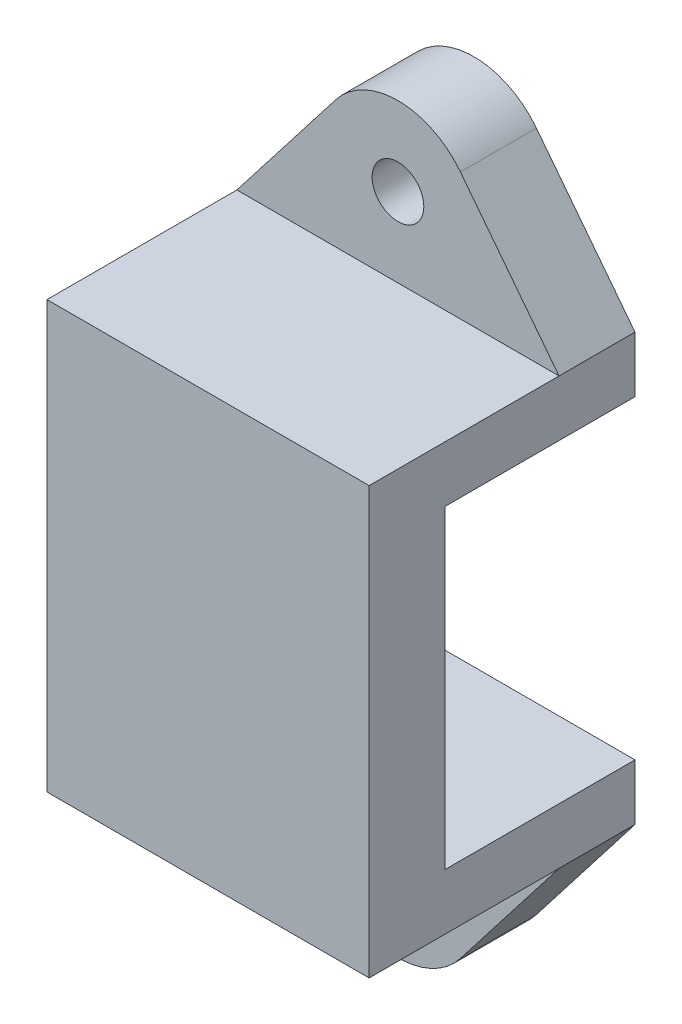
ISO-10303-21;
HEADER;
FILE_DESCRIPTION(('STEP AP214'),'2;1');
FILE_NAME('part.step','',(''),(''),'','','');
FILE_SCHEMA(('AUTOMOTIVE_DESIGN { 1 0 10303 214 1 1 1 1 }'));
ENDSEC;
DATA;
#1=APPLICATION_CONTEXT('core data for automotive mechanical design processes');
#2=APPLICATION_PROTOCOL_DEFINITION('international standard','automotive_design',2000,#1);
#3=PRODUCT_CONTEXT('',#1,'mechanical');
#4=PRODUCT('Part','Part','',(#3));
#5=PRODUCT_RELATED_PRODUCT_CATEGORY('part','',(#4));
#6=PRODUCT_DEFINITION_FORMATION('','',#4);
#7=PRODUCT_DEFINITION_CONTEXT('part definition',#1,'design');
#8=PRODUCT_DEFINITION('design','',#6,#7);
#9=PRODUCT_DEFINITION_SHAPE('','',#8);
#10=(LENGTH_UNIT() NAMED_UNIT(*) SI_UNIT(.MILLI.,.METRE.));
#11=(NAMED_UNIT(*) PLANE_ANGLE_UNIT() SI_UNIT($,.RADIAN.));
#12=(NAMED_UNIT(*) SI_UNIT($,.STERADIAN.) SOLID_ANGLE_UNIT());
#13=UNCERTAINTY_MEASURE_WITH_UNIT(LENGTH_MEASURE(1.E-05),#10,'distance_accuracy_value','');
#14=(GEOMETRIC_REPRESENTATION_CONTEXT(3) GLOBAL_UNCERTAINTY_ASSIGNED_CONTEXT((#13)) GLOBAL_UNIT_ASSIGNED_CONTEXT((#10,
#11,#12)) REPRESENTATION_CONTEXT('',''));
#15=CARTESIAN_POINT('',(0.,0.,0.));
#16=DIRECTION('',(0.,0.,1.));
#17=DIRECTION('',(1.,0.,0.));
#18=AXIS2_PLACEMENT_3D('',#15,#16,#17);
#19=CARTESIAN_POINT('',(0.,0.,12.5000000000008));
#20=DIRECTION('',(0.,0.,1.));
#21=DIRECTION('',(1.,0.,0.));
#22=AXIS2_PLACEMENT_3D('',#19,#20,#21);
#23=PLANE('',#22);
#24=DIRECTION('',(1.,0.,0.));
#25=VECTOR('',#24,1.);
#26=CARTESIAN_POINT('',(22.2055513527355,11.7623361331075,12.5000000000011));
#27=LINE('',#26,#25);
#28=CARTESIAN_POINT('',(0.999999999999351,11.7623361331061,12.5000000000008));
#29=VERTEX_POINT('',#28);
#30=CARTESIAN_POINT('',(22.2055513527353,11.7623361331075,12.5000000000011));
#31=VERTEX_POINT('',#30);
#32=EDGE_CURVE('E188',#29,#31,#27,.T.);
#33=ORIENTED_EDGE('',*,*,#32,.F.);
#34=DIRECTION('',(0.,-1.,0.));
#35=VECTOR('',#34,1.);
#36=CARTESIAN_POINT('',(0.999999999999353,36.146663352379,12.5000000000008));
#37=LINE('',#36,#35);
#38=CARTESIAN_POINT('',(0.999999999999353,32.4623361331075,12.5000000000008));
#39=VERTEX_POINT('',#38);
#40=EDGE_CURVE('E225',#39,#29,#37,.T.);
#41=ORIENTED_EDGE('',*,*,#40,.F.);
#42=DIRECTION('',(-1.,0.,0.));
#43=VECTOR('',#42,1.);
#44=CARTESIAN_POINT('',(0.999999999999578,32.4623361331075,12.5000000000008));
#45=LINE('',#44,#43);
#46=CARTESIAN_POINT('',(22.2055513527353,32.4623361331075,12.5000000000008));
#47=VERTEX_POINT('',#46);
#48=EDGE_CURVE('E239',#47,#39,#45,.T.);
#49=ORIENTED_EDGE('',*,*,#48,.F.);
#50=DIRECTION('',(0.,1.,0.));
#51=VECTOR('',#50,1.);
#52=CARTESIAN_POINT('',(22.2055513527353,36.146663352379,12.5000000000008));
#53=LINE('',#52,#51);
#54=EDGE_CURVE('E230',#31,#47,#53,.T.);
#55=ORIENTED_EDGE('',*,*,#54,.F.);
#56=EDGE_LOOP('',(#33,#41,#49,#55));
#57=FACE_BOUND('',#56,.T.);
#58=ADVANCED_FACE('F40',(#57),#23,.F.);
#59=CARTESIAN_POINT('',(0.,32.4623361331075,5.));
#60=DIRECTION('',(0.,-1.,0.));
#61=DIRECTION('',(0.,0.,-1.));
#62=AXIS2_PLACEMENT_3D('',#59,#60,#61);
#63=PLANE('',#62);
#64=DIRECTION('',(-1.,0.,0.));
#65=VECTOR('',#64,1.);
#66=CARTESIAN_POINT('',(0.,32.4623361331075,0.));
#67=LINE('',#66,#65);
#68=CARTESIAN_POINT('',(22.2055513527353,32.4623361331075,0.));
#69=VERTEX_POINT('',#68);
#70=CARTESIAN_POINT('',(0.999999999999506,32.4623361331075,0.));
#71=VERTEX_POINT('',#70);
#72=EDGE_CURVE('E241',#69,#71,#67,.T.);
#73=ORIENTED_EDGE('',*,*,#72,.F.);
#74=DIRECTION('',(0.,0.,-1.));
#75=VECTOR('',#74,1.);
#76=CARTESIAN_POINT('',(22.2055513527353,32.4623361331075,5.));
#77=LINE('',#76,#75);
#78=EDGE_CURVE('E11',#47,#69,#77,.T.);
#79=ORIENTED_EDGE('',*,*,#78,.F.);
#80=ORIENTED_EDGE('',*,*,#48,.T.);
#81=DIRECTION('',(0.,0.,-1.));
#82=VECTOR('',#81,1.);
#83=CARTESIAN_POINT('',(0.999999999999506,32.4623361331075,5.));
#84=LINE('',#83,#82);
#85=EDGE_CURVE('E87',#39,#71,#84,.T.);
#86=ORIENTED_EDGE('',*,*,#85,.T.);
#87=EDGE_LOOP('',(#73,#79,#80,#86));
#88=FACE_BOUND('',#87,.T.);
#89=ADVANCED_FACE('F42',(#88),#63,.T.);
#90=CARTESIAN_POINT('',(22.2055513527353,0.,5.));
#91=DIRECTION('',(1.,0.,0.));
#92=DIRECTION('',(0.,1.,0.));
#93=AXIS2_PLACEMENT_3D('',#90,#91,#92);
#94=PLANE('',#93);
#95=DIRECTION('',(0.,-1.,0.));
#96=VECTOR('',#95,1.);
#97=CARTESIAN_POINT('',(22.2055513527353,0.,0.));
#98=LINE('',#97,#96);
#99=CARTESIAN_POINT('',(22.2055513527354,36.146663352379,0.));
#100=VERTEX_POINT('',#99);
#101=EDGE_CURVE('E260',#100,#69,#98,.T.);
#102=ORIENTED_EDGE('',*,*,#101,.F.);
#103=DIRECTION('',(0.,0.,-1.));
#104=VECTOR('',#103,1.);
#105=CARTESIAN_POINT('',(22.2055513527354,36.146663352379,5.));
#106=LINE('',#105,#104);
#107=CARTESIAN_POINT('',(22.2055513527354,36.146663352379,5.));
#108=VERTEX_POINT('',#107);
#109=EDGE_CURVE('E49',#108,#100,#106,.T.);
#110=ORIENTED_EDGE('',*,*,#109,.F.);
#111=DIRECTION('',(0.,0.,-1.));
#112=VECTOR('',#111,1.);
#113=CARTESIAN_POINT('',(22.2055513527353,36.146663352379,34.2232357054472));
#114=LINE('',#113,#112);
#115=CARTESIAN_POINT('',(22.2055513527353,36.146663352379,17.5000000000008));
#116=VERTEX_POINT('',#115);
#117=EDGE_CURVE('E244',#116,#108,#114,.T.);
#118=ORIENTED_EDGE('',*,*,#117,.F.);
#119=DIRECTION('',(0.,1.,0.));
#120=VECTOR('',#119,1.);
#121=CARTESIAN_POINT('',(22.2055513527353,36.146663352379,17.5000000000008));
#122=LINE('',#121,#120);
#123=CARTESIAN_POINT('',(22.2055513527353,8.07800891383467,17.5000000000008));
#124=VERTEX_POINT('',#123);
#125=EDGE_CURVE('E159',#124,#116,#122,.T.);
#126=ORIENTED_EDGE('',*,*,#125,.F.);
#127=DIRECTION('',(0.,0.,-1.));
#128=VECTOR('',#127,1.);
#129=CARTESIAN_POINT('',(22.2055513527353,8.07800891383467,17.5000000000008));
#130=LINE('',#129,#128);
#131=CARTESIAN_POINT('',(22.2055513527353,8.07800891383467,5.));
#132=VERTEX_POINT('',#131);
#133=EDGE_CURVE('E151',#124,#132,#130,.T.);
#134=ORIENTED_EDGE('',*,*,#133,.T.);
#135=DIRECTION('',(0.,0.,-1.));
#136=VECTOR('',#135,1.);
#137=CARTESIAN_POINT('',(22.2055513527353,8.07800891383467,5.));
#138=LINE('',#137,#136);
#139=CARTESIAN_POINT('',(22.2055513527353,8.07800891383467,0.));
#140=VERTEX_POINT('',#139);
#141=EDGE_CURVE('E156',#132,#140,#138,.T.);
#142=ORIENTED_EDGE('',*,*,#141,.T.);
#143=DIRECTION('',(0.,1.,0.));
#144=VECTOR('',#143,1.);
#145=CARTESIAN_POINT('',(22.2055513527353,0.,0.));
#146=LINE('',#145,#144);
#147=CARTESIAN_POINT('',(22.2055513527353,11.7623361331075,0.));
#148=VERTEX_POINT('',#147);
#149=EDGE_CURVE('E204',#140,#148,#146,.T.);
#150=ORIENTED_EDGE('',*,*,#149,.T.);
#151=DIRECTION('',(0.,0.,-1.));
#152=VECTOR('',#151,1.);
#153=CARTESIAN_POINT('',(22.2055513527353,11.7623361331075,5.));
#154=LINE('',#153,#152);
#155=EDGE_CURVE('E184',#31,#148,#154,.T.);
#156=ORIENTED_EDGE('',*,*,#155,.F.);
#157=ORIENTED_EDGE('',*,*,#54,.T.);
#158=ORIENTED_EDGE('',*,*,#78,.T.);
#159=EDGE_LOOP('',(#102,#110,#118,#126,#134,#142,#150,#156,#157,#158));
#160=FACE_BOUND('',#159,.T.);
#161=ADVANCED_FACE('F154',(#160),#94,.T.);
#162=CARTESIAN_POINT('',(31.3785852926712,24.3029777336081,5.));
#163=DIRECTION('',(-0.790603200713041,-0.612328816096625,0.));
#164=DIRECTION('',(0.612328816096625,-0.790603200713041,0.));
#165=AXIS2_PLACEMENT_3D('',#162,#163,#164);
#166=PLANE('',#165);
#167=DIRECTION('',(-0.612328816096625,0.790603200713041,0.));
#168=VECTOR('',#167,1.);
#169=CARTESIAN_POINT('',(31.3785852926712,24.3029777336081,0.));
#170=LINE('',#169,#168);
#171=CARTESIAN_POINT('',(15.713166275487,44.5292517385579,0.));
#172=VERTEX_POINT('',#171);
#173=EDGE_CURVE('E263',#100,#172,#170,.T.);
#174=ORIENTED_EDGE('',*,*,#173,.T.);
#175=DIRECTION('',(0.,0.,-1.));
#176=VECTOR('',#175,1.);
#177=CARTESIAN_POINT('',(15.713166275487,44.5292517385579,5.));
#178=LINE('',#177,#176);
#179=CARTESIAN_POINT('',(15.713166275487,44.5292517385579,5.));
#180=VERTEX_POINT('',#179);
#181=EDGE_CURVE('E277',#180,#172,#178,.T.);
#182=ORIENTED_EDGE('',*,*,#181,.F.);
#183=DIRECTION('',(-0.612328816096625,0.790603200713041,0.));
#184=VECTOR('',#183,1.);
#185=CARTESIAN_POINT('',(31.3785852926712,24.3029777336081,5.));
#186=LINE('',#185,#184);
#187=EDGE_CURVE('E249',#108,#180,#186,.T.);
#188=ORIENTED_EDGE('',*,*,#187,.F.);
#189=ORIENTED_EDGE('',*,*,#109,.T.);
#190=EDGE_LOOP('',(#174,#182,#188,#189));
#191=FACE_BOUND('',#190,.T.);
#192=ADVANCED_FACE('F282',(#191),#166,.F.);
#193=CARTESIAN_POINT('',(11.6027756763675,41.3457197126521,5.));
#194=DIRECTION('',(0.,0.,-1.));
#195=DIRECTION('',(-1.,0.,0.));
#196=AXIS2_PLACEMENT_3D('',#193,#194,#195);
#197=CYLINDRICAL_SURFACE('',#196,5.19905636027319);
#198=CARTESIAN_POINT('',(11.6027756763675,41.3457197126521,0.));
#199=DIRECTION('',(0.,0.,1.));
#200=DIRECTION('',(1.,0.,0.));
#201=AXIS2_PLACEMENT_3D('',#198,#199,#200);
#202=CIRCLE('',#201,5.19905636027319);
#203=CARTESIAN_POINT('',(7.492385077248,44.5292517385579,0.));
#204=VERTEX_POINT('',#203);
#205=EDGE_CURVE('E265',#172,#204,#202,.T.);
#206=ORIENTED_EDGE('',*,*,#205,.T.);
#207=DIRECTION('',(0.,0.,-1.));
#208=VECTOR('',#207,1.);
#209=CARTESIAN_POINT('',(7.492385077248,44.5292517385579,5.));
#210=LINE('',#209,#208);
#211=CARTESIAN_POINT('',(7.492385077248,44.5292517385579,5.));
#212=VERTEX_POINT('',#211);
#213=EDGE_CURVE('E275',#212,#204,#210,.T.);
#214=ORIENTED_EDGE('',*,*,#213,.F.);
#215=CARTESIAN_POINT('',(11.6027756763675,41.3457197126521,5.));
#216=DIRECTION('',(0.,0.,1.));
#217=DIRECTION('',(1.,0.,0.));
#218=AXIS2_PLACEMENT_3D('',#215,#216,#217);
#219=CIRCLE('',#218,5.19905636027319);
#220=EDGE_CURVE('E57',#180,#212,#219,.T.);
#221=ORIENTED_EDGE('',*,*,#220,.F.);
#222=ORIENTED_EDGE('',*,*,#181,.T.);
#223=EDGE_LOOP('',(#206,#214,#221,#222));
#224=FACE_BOUND('',#223,.T.);
#225=ADVANCED_FACE('F508',(#224),#197,.T.);
#226=CARTESIAN_POINT('',(-16.8738760339704,13.0689586451504,5.));
#227=DIRECTION('',(0.790603200713041,-0.612328816096625,0.));
#228=DIRECTION('',(0.612328816096625,0.790603200713041,0.));
#229=AXIS2_PLACEMENT_3D('',#226,#227,#228);
#230=PLANE('',#229);
#231=DIRECTION('',(-0.612328816096625,-0.790603200713041,0.));
#232=VECTOR('',#231,1.);
#233=CARTESIAN_POINT('',(-16.8738760339704,13.0689586451504,0.));
#234=LINE('',#233,#232);
#235=CARTESIAN_POINT('',(0.999999999999506,36.146663352379,0.));
#236=VERTEX_POINT('',#235);
#237=EDGE_CURVE('E80',#204,#236,#234,.T.);
#238=ORIENTED_EDGE('',*,*,#237,.T.);
#239=DIRECTION('',(0.,0.,-1.));
#240=VECTOR('',#239,1.);
#241=CARTESIAN_POINT('',(0.999999999999506,36.146663352379,5.));
#242=LINE('',#241,#240);
#243=CARTESIAN_POINT('',(0.999999999999353,36.146663352379,5.));
#244=VERTEX_POINT('',#243);
#245=EDGE_CURVE('E273',#244,#236,#242,.T.);
#246=ORIENTED_EDGE('',*,*,#245,.F.);
#247=DIRECTION('',(-0.612328816096625,-0.790603200713041,0.));
#248=VECTOR('',#247,1.);
#249=CARTESIAN_POINT('',(-16.8738760339704,13.0689586451504,5.));
#250=LINE('',#249,#248);
#251=EDGE_CURVE('E253',#212,#244,#250,.T.);
#252=ORIENTED_EDGE('',*,*,#251,.F.);
#253=ORIENTED_EDGE('',*,*,#213,.T.);
#254=EDGE_LOOP('',(#238,#246,#252,#253));
#255=FACE_BOUND('',#254,.T.);
#256=ADVANCED_FACE('F296',(#255),#230,.F.);
#257=CARTESIAN_POINT('',(0.999999999999506,0.,5.));
#258=DIRECTION('',(1.,0.,0.));
#259=DIRECTION('',(0.,1.,0.));
#260=AXIS2_PLACEMENT_3D('',#257,#258,#259);
#261=PLANE('',#260);
#262=DIRECTION('',(0.,-1.,0.));
#263=VECTOR('',#262,1.);
#264=CARTESIAN_POINT('',(0.999999999999506,0.,0.));
#265=LINE('',#264,#263);
#266=EDGE_CURVE('E268',#236,#71,#265,.T.);
#267=ORIENTED_EDGE('',*,*,#266,.T.);
#268=ORIENTED_EDGE('',*,*,#85,.F.);
#269=ORIENTED_EDGE('',*,*,#40,.T.);
#270=DIRECTION('',(0.,0.,-1.));
#271=VECTOR('',#270,1.);
#272=CARTESIAN_POINT('',(0.999999999999351,11.7623361331061,5.));
#273=LINE('',#272,#271);
#274=CARTESIAN_POINT('',(0.999999999999351,11.7623361331061,0.));
#275=VERTEX_POINT('',#274);
#276=EDGE_CURVE('E219',#29,#275,#273,.T.);
#277=ORIENTED_EDGE('',*,*,#276,.T.);
#278=DIRECTION('',(0.,-1.,0.));
#279=VECTOR('',#278,1.);
#280=CARTESIAN_POINT('',(0.999999999999358,0.,0.));
#281=LINE('',#280,#279);
#282=CARTESIAN_POINT('',(0.999999999999353,8.07800891383467,0.));
#283=VERTEX_POINT('',#282);
#284=EDGE_CURVE('E208',#275,#283,#281,.T.);
#285=ORIENTED_EDGE('',*,*,#284,.T.);
#286=DIRECTION('',(0.,0.,-1.));
#287=VECTOR('',#286,1.);
#288=CARTESIAN_POINT('',(0.999999999999353,8.07800891383467,5.));
#289=LINE('',#288,#287);
#290=CARTESIAN_POINT('',(0.999999999999353,8.07800891383467,5.));
#291=VERTEX_POINT('',#290);
#292=EDGE_CURVE('E216',#291,#283,#289,.T.);
#293=ORIENTED_EDGE('',*,*,#292,.F.);
#294=DIRECTION('',(0.,0.,-1.));
#295=VECTOR('',#294,1.);
#296=CARTESIAN_POINT('',(0.999999999999353,8.07800891383467,17.5000000000008));
#297=LINE('',#296,#295);
#298=CARTESIAN_POINT('',(0.999999999999353,8.07800891383467,17.5000000000008));
#299=VERTEX_POINT('',#298);
#300=EDGE_CURVE('E162',#299,#291,#297,.T.);
#301=ORIENTED_EDGE('',*,*,#300,.F.);
#302=DIRECTION('',(0.,-1.,0.));
#303=VECTOR('',#302,1.);
#304=CARTESIAN_POINT('',(0.999999999999353,36.146663352379,17.5000000000008));
#305=LINE('',#304,#303);
#306=CARTESIAN_POINT('',(0.999999999999353,36.146663352379,17.5000000000008));
#307=VERTEX_POINT('',#306);
#308=EDGE_CURVE('E226',#307,#299,#305,.T.);
#309=ORIENTED_EDGE('',*,*,#308,.F.);
#310=DIRECTION('',(0.,0.,-1.));
#311=VECTOR('',#310,1.);
#312=CARTESIAN_POINT('',(0.999999999999353,36.146663352379,34.2232357054472));
#313=LINE('',#312,#311);
#314=EDGE_CURVE('E242',#307,#244,#313,.T.);
#315=ORIENTED_EDGE('',*,*,#314,.T.);
#316=ORIENTED_EDGE('',*,*,#245,.T.);
#317=EDGE_LOOP('',(#267,#268,#269,#277,#285,#293,#301,#309,#315,#316));
#318=FACE_BOUND('',#317,.T.);
#319=ADVANCED_FACE('F293',(#318),#261,.F.);
#320=CARTESIAN_POINT('',(11.6027756763675,41.3457197126521,5.));
#321=DIRECTION('',(0.,0.,-1.));
#322=DIRECTION('',(-1.,0.,0.));
#323=AXIS2_PLACEMENT_3D('',#320,#321,#322);
#324=CYLINDRICAL_SURFACE('',#323,1.70000000000015);
#325=CARTESIAN_POINT('',(11.6027756763675,41.3457197126521,5.));
#326=DIRECTION('',(0.,0.,1.));
#327=DIRECTION('',(1.,0.,0.));
#328=AXIS2_PLACEMENT_3D('',#325,#326,#327);
#329=CIRCLE('',#328,1.70000000000015);
#330=CARTESIAN_POINT('',(13.3027756763676,41.3457197126521,5.));
#331=VERTEX_POINT('',#330);
#332=EDGE_CURVE('E255',#331,#331,#329,.F.);
#333=ORIENTED_EDGE('',*,*,#332,.F.);
#334=EDGE_LOOP('',(#333));
#335=FACE_BOUND('',#334,.T.);
#336=CARTESIAN_POINT('',(11.6027756763675,41.3457197126521,0.));
#337=DIRECTION('',(0.,0.,1.));
#338=DIRECTION('',(1.,0.,0.));
#339=AXIS2_PLACEMENT_3D('',#336,#337,#338);
#340=CIRCLE('',#339,1.70000000000015);
#341=CARTESIAN_POINT('',(13.3027756763676,41.3457197126521,0.));
#342=VERTEX_POINT('',#341);
#343=EDGE_CURVE('E251',#342,#342,#340,.F.);
#344=ORIENTED_EDGE('',*,*,#343,.T.);
#345=EDGE_LOOP('',(#344));
#346=FACE_BOUND('',#345,.T.);
#347=ADVANCED_FACE('F300',(#335,#346),#324,.F.);
#348=CARTESIAN_POINT('',(0.,0.,5.));
#349=DIRECTION('',(0.,0.,1.));
#350=DIRECTION('',(1.,0.,0.));
#351=AXIS2_PLACEMENT_3D('',#348,#349,#350);
#352=PLANE('',#351);
#353=DIRECTION('',(-1.,0.,0.));
#354=VECTOR('',#353,1.);
#355=CARTESIAN_POINT('',(22.2055513527353,36.146663352379,5.));
#356=LINE('',#355,#354);
#357=EDGE_CURVE('E91',#108,#244,#356,.T.);
#358=ORIENTED_EDGE('',*,*,#357,.F.);
#359=ORIENTED_EDGE('',*,*,#187,.T.);
#360=ORIENTED_EDGE('',*,*,#220,.T.);
#361=ORIENTED_EDGE('',*,*,#251,.T.);
#362=EDGE_LOOP('',(#358,#359,#360,#361));
#363=FACE_BOUND('',#362,.T.);
#364=ORIENTED_EDGE('',*,*,#332,.T.);
#365=EDGE_LOOP('',(#364));
#366=FACE_BOUND('',#365,.T.);
#367=ADVANCED_FACE('F297',(#363,#366),#352,.T.);
#368=CARTESIAN_POINT('',(0.,0.,0.));
#369=DIRECTION('',(0.,0.,1.));
#370=DIRECTION('',(1.,0.,0.));
#371=AXIS2_PLACEMENT_3D('',#368,#369,#370);
#372=PLANE('',#371);
#373=ORIENTED_EDGE('',*,*,#72,.T.);
#374=ORIENTED_EDGE('',*,*,#266,.F.);
#375=ORIENTED_EDGE('',*,*,#237,.F.);
#376=ORIENTED_EDGE('',*,*,#205,.F.);
#377=ORIENTED_EDGE('',*,*,#173,.F.);
#378=ORIENTED_EDGE('',*,*,#101,.T.);
#379=EDGE_LOOP('',(#373,#374,#375,#376,#377,#378));
#380=FACE_BOUND('',#379,.T.);
#381=ORIENTED_EDGE('',*,*,#343,.F.);
#382=EDGE_LOOP('',(#381));
#383=FACE_BOUND('',#382,.T.);
#384=ADVANCED_FACE('F286',(#380,#383),#372,.F.);
#385=CARTESIAN_POINT('',(22.2055513527353,36.146663352379,34.2232357054472));
#386=DIRECTION('',(0.,-1.,0.));
#387=DIRECTION('',(1.,0.,0.));
#388=AXIS2_PLACEMENT_3D('',#385,#386,#387);
#389=PLANE('',#388);
#390=ORIENTED_EDGE('',*,*,#314,.F.);
#391=DIRECTION('',(-1.,0.,0.));
#392=VECTOR('',#391,1.);
#393=CARTESIAN_POINT('',(0.999999999999353,36.146663352379,17.5000000000008));
#394=LINE('',#393,#392);
#395=EDGE_CURVE('E163',#116,#307,#394,.T.);
#396=ORIENTED_EDGE('',*,*,#395,.F.);
#397=ORIENTED_EDGE('',*,*,#117,.T.);
#398=ORIENTED_EDGE('',*,*,#357,.T.);
#399=EDGE_LOOP('',(#390,#396,#397,#398));
#400=FACE_BOUND('',#399,.T.);
#401=ADVANCED_FACE('F309',(#400),#389,.F.);
#402=CARTESIAN_POINT('',(0.999999999999353,8.07800891383467,17.5000000000008));
#403=DIRECTION('',(0.,1.,0.));
#404=DIRECTION('',(0.,0.,1.));
#405=AXIS2_PLACEMENT_3D('',#402,#403,#404);
#406=PLANE('',#405);
#407=ORIENTED_EDGE('',*,*,#300,.T.);
#408=DIRECTION('',(1.,0.,0.));
#409=VECTOR('',#408,1.);
#410=CARTESIAN_POINT('',(0.999999999999353,8.07800891383467,5.));
#411=LINE('',#410,#409);
#412=EDGE_CURVE('E172',#291,#132,#411,.T.);
#413=ORIENTED_EDGE('',*,*,#412,.T.);
#414=ORIENTED_EDGE('',*,*,#133,.F.);
#415=DIRECTION('',(1.,0.,0.));
#416=VECTOR('',#415,1.);
#417=CARTESIAN_POINT('',(0.999999999999353,8.07800891383467,17.5000000000008));
#418=LINE('',#417,#416);
#419=EDGE_CURVE('E229',#299,#124,#418,.T.);
#420=ORIENTED_EDGE('',*,*,#419,.F.);
#421=EDGE_LOOP('',(#407,#413,#414,#420));
#422=FACE_BOUND('',#421,.T.);
#423=ADVANCED_FACE('F186',(#422),#406,.F.);
#424=CARTESIAN_POINT('',(0.,0.,17.5000000000008));
#425=DIRECTION('',(0.,0.,1.));
#426=DIRECTION('',(1.,0.,0.));
#427=AXIS2_PLACEMENT_3D('',#424,#425,#426);
#428=PLANE('',#427);
#429=ORIENTED_EDGE('',*,*,#308,.T.);
#430=ORIENTED_EDGE('',*,*,#419,.T.);
#431=ORIENTED_EDGE('',*,*,#125,.T.);
#432=ORIENTED_EDGE('',*,*,#395,.T.);
#433=EDGE_LOOP('',(#429,#430,#431,#432));
#434=FACE_BOUND('',#433,.T.);
#435=ADVANCED_FACE('F325',(#434),#428,.T.);
#436=CARTESIAN_POINT('',(11.6027756763673,2.87895255356147,5.));
#437=DIRECTION('',(0.,0.,-1.));
#438=DIRECTION('',(-1.,0.,0.));
#439=AXIS2_PLACEMENT_3D('',#436,#437,#438);
#440=CYLINDRICAL_SURFACE('',#439,5.19905636027319);
#441=CARTESIAN_POINT('',(11.6027756763673,2.87895255356147,0.));
#442=DIRECTION('',(0.,0.,1.));
#443=DIRECTION('',(1.,0.,0.));
#444=AXIS2_PLACEMENT_3D('',#441,#442,#443);
#445=CIRCLE('',#444,5.19905636027319);
#446=CARTESIAN_POINT('',(15.7131662754868,-0.304579472344232,0.));
#447=VERTEX_POINT('',#446);
#448=CARTESIAN_POINT('',(7.49238507724785,-0.304579472344239,0.));
#449=VERTEX_POINT('',#448);
#450=EDGE_CURVE('E191',#447,#449,#445,.F.);
#451=ORIENTED_EDGE('',*,*,#450,.F.);
#452=DIRECTION('',(0.,0.,-1.));
#453=VECTOR('',#452,1.);
#454=CARTESIAN_POINT('',(15.7131662754868,-0.304579472344232,5.));
#455=LINE('',#454,#453);
#456=CARTESIAN_POINT('',(15.7131662754868,-0.304579472344232,5.));
#457=VERTEX_POINT('',#456);
#458=EDGE_CURVE('E183',#457,#447,#455,.T.);
#459=ORIENTED_EDGE('',*,*,#458,.F.);
#460=CARTESIAN_POINT('',(11.6027756763673,2.87895255356147,5.));
#461=DIRECTION('',(0.,0.,1.));
#462=DIRECTION('',(1.,0.,0.));
#463=AXIS2_PLACEMENT_3D('',#460,#461,#462);
#464=CIRCLE('',#463,5.19905636027319);
#465=CARTESIAN_POINT('',(7.49238507724785,-0.304579472344239,5.));
#466=VERTEX_POINT('',#465);
#467=EDGE_CURVE('E175',#457,#466,#464,.F.);
#468=ORIENTED_EDGE('',*,*,#467,.T.);
#469=DIRECTION('',(0.,0.,-1.));
#470=VECTOR('',#469,1.);
#471=CARTESIAN_POINT('',(7.49238507724785,-0.304579472344239,5.));
#472=LINE('',#471,#470);
#473=EDGE_CURVE('E200',#466,#449,#472,.T.);
#474=ORIENTED_EDGE('',*,*,#473,.T.);
#475=EDGE_LOOP('',(#451,#459,#468,#474));
#476=FACE_BOUND('',#475,.T.);
#477=ADVANCED_FACE('F331',(#476),#440,.T.);
#478=CARTESIAN_POINT('',(9.96901803578829,-7.72108815900909,5.));
#479=DIRECTION('',(0.790603200713041,-0.612328816096625,0.));
#480=DIRECTION('',(0.612328816096625,0.790603200713041,0.));
#481=AXIS2_PLACEMENT_3D('',#478,#479,#480);
#482=PLANE('',#481);
#483=DIRECTION('',(-0.612328816096625,-0.790603200713041,0.));
#484=VECTOR('',#483,1.);
#485=CARTESIAN_POINT('',(9.96901803578829,-7.72108815900909,0.));
#486=LINE('',#485,#484);
#487=EDGE_CURVE('E182',#140,#447,#486,.T.);
#488=ORIENTED_EDGE('',*,*,#487,.F.);
#489=ORIENTED_EDGE('',*,*,#141,.F.);
#490=DIRECTION('',(-0.612328816096625,-0.790603200713041,0.));
#491=VECTOR('',#490,1.);
#492=CARTESIAN_POINT('',(9.96901803578829,-7.72108815900909,5.));
#493=LINE('',#492,#491);
#494=EDGE_CURVE('E169',#132,#457,#493,.T.);
#495=ORIENTED_EDGE('',*,*,#494,.T.);
#496=ORIENTED_EDGE('',*,*,#458,.T.);
#497=EDGE_LOOP('',(#488,#489,#495,#496));
#498=FACE_BOUND('',#497,.T.);
#499=ADVANCED_FACE('F180',(#498),#482,.T.);
#500=CARTESIAN_POINT('',(0.,11.7623361331075,5.));
#501=DIRECTION('',(0.,-1.,0.));
#502=DIRECTION('',(1.,0.,0.));
#503=AXIS2_PLACEMENT_3D('',#500,#501,#502);
#504=PLANE('',#503);
#505=DIRECTION('',(-1.,0.,0.));
#506=VECTOR('',#505,1.);
#507=CARTESIAN_POINT('',(0.,11.7623361331075,0.));
#508=LINE('',#507,#506);
#509=EDGE_CURVE('E206',#148,#275,#508,.T.);
#510=ORIENTED_EDGE('',*,*,#509,.T.);
#511=ORIENTED_EDGE('',*,*,#276,.F.);
#512=ORIENTED_EDGE('',*,*,#32,.T.);
#513=ORIENTED_EDGE('',*,*,#155,.T.);
#514=EDGE_LOOP('',(#510,#511,#512,#513));
#515=FACE_BOUND('',#514,.T.);
#516=ADVANCED_FACE('F350',(#515),#504,.F.);
#517=CARTESIAN_POINT('',(4.53569122291232,3.51293092944841,5.));
#518=DIRECTION('',(0.790603200713041,0.612328816096625,0.));
#519=DIRECTION('',(-0.612328816096625,0.790603200713041,0.));
#520=AXIS2_PLACEMENT_3D('',#517,#518,#519);
#521=PLANE('',#520);
#522=DIRECTION('',(0.612328816096625,-0.790603200713041,0.));
#523=VECTOR('',#522,1.);
#524=CARTESIAN_POINT('',(4.53569122291232,3.51293092944841,0.));
#525=LINE('',#524,#523);
#526=EDGE_CURVE('E210',#283,#449,#525,.T.);
#527=ORIENTED_EDGE('',*,*,#526,.T.);
#528=ORIENTED_EDGE('',*,*,#473,.F.);
#529=DIRECTION('',(0.612328816096625,-0.790603200713041,0.));
#530=VECTOR('',#529,1.);
#531=CARTESIAN_POINT('',(4.53569122291232,3.51293092944841,5.));
#532=LINE('',#531,#530);
#533=EDGE_CURVE('E177',#291,#466,#532,.T.);
#534=ORIENTED_EDGE('',*,*,#533,.F.);
#535=ORIENTED_EDGE('',*,*,#292,.T.);
#536=EDGE_LOOP('',(#527,#528,#534,#535));
#537=FACE_BOUND('',#536,.T.);
#538=ADVANCED_FACE('F343',(#537),#521,.F.);
#539=CARTESIAN_POINT('',(11.6027756763675,2.87895255356285,5.));
#540=DIRECTION('',(0.,0.,-1.));
#541=DIRECTION('',(-1.,0.,0.));
#542=AXIS2_PLACEMENT_3D('',#539,#540,#541);
#543=CYLINDRICAL_SURFACE('',#542,1.70000000000015);
#544=CARTESIAN_POINT('',(11.6027756763675,2.87895255356285,5.));
#545=DIRECTION('',(0.,0.,1.));
#546=DIRECTION('',(1.,0.,0.));
#547=AXIS2_PLACEMENT_3D('',#544,#545,#546);
#548=CIRCLE('',#547,1.70000000000015);
#549=CARTESIAN_POINT('',(13.3027756763676,2.87895255356285,5.));
#550=VERTEX_POINT('',#549);
#551=EDGE_CURVE('E197',#550,#550,#548,.F.);
#552=ORIENTED_EDGE('',*,*,#551,.F.);
#553=EDGE_LOOP('',(#552));
#554=FACE_BOUND('',#553,.T.);
#555=CARTESIAN_POINT('',(11.6027756763675,2.87895255356285,0.));
#556=DIRECTION('',(0.,0.,1.));
#557=DIRECTION('',(1.,0.,0.));
#558=AXIS2_PLACEMENT_3D('',#555,#556,#557);
#559=CIRCLE('',#558,1.70000000000015);
#560=CARTESIAN_POINT('',(13.3027756763676,2.87895255356285,0.));
#561=VERTEX_POINT('',#560);
#562=EDGE_CURVE('E194',#561,#561,#559,.F.);
#563=ORIENTED_EDGE('',*,*,#562,.T.);
#564=EDGE_LOOP('',(#563));
#565=FACE_BOUND('',#564,.T.);
#566=ADVANCED_FACE('F357',(#554,#565),#543,.F.);
#567=CARTESIAN_POINT('',(0.,0.,5.));
#568=DIRECTION('',(0.,0.,1.));
#569=DIRECTION('',(1.,0.,0.));
#570=AXIS2_PLACEMENT_3D('',#567,#568,#569);
#571=PLANE('',#570);
#572=ORIENTED_EDGE('',*,*,#412,.F.);
#573=ORIENTED_EDGE('',*,*,#533,.T.);
#574=ORIENTED_EDGE('',*,*,#467,.F.);
#575=ORIENTED_EDGE('',*,*,#494,.F.);
#576=EDGE_LOOP('',(#572,#573,#574,#575));
#577=FACE_BOUND('',#576,.T.);
#578=ORIENTED_EDGE('',*,*,#551,.T.);
#579=EDGE_LOOP('',(#578));
#580=FACE_BOUND('',#579,.T.);
#581=ADVANCED_FACE('F170',(#577,#580),#571,.T.);
#582=CARTESIAN_POINT('',(0.,0.,0.));
#583=DIRECTION('',(0.,0.,1.));
#584=DIRECTION('',(1.,0.,0.));
#585=AXIS2_PLACEMENT_3D('',#582,#583,#584);
#586=PLANE('',#585);
#587=ORIENTED_EDGE('',*,*,#450,.T.);
#588=ORIENTED_EDGE('',*,*,#526,.F.);
#589=ORIENTED_EDGE('',*,*,#284,.F.);
#590=ORIENTED_EDGE('',*,*,#509,.F.);
#591=ORIENTED_EDGE('',*,*,#149,.F.);
#592=ORIENTED_EDGE('',*,*,#487,.T.);
#593=EDGE_LOOP('',(#587,#588,#589,#590,#591,#592));
#594=FACE_BOUND('',#593,.T.);
#595=ORIENTED_EDGE('',*,*,#562,.F.);
#596=EDGE_LOOP('',(#595));
#597=FACE_BOUND('',#596,.T.);
#598=ADVANCED_FACE('F346',(#594,#597),#586,.F.);
#599=CLOSED_SHELL('',(#58,#89,#161,#192,#225,#256,#319,#347,#367,#384,#401,#423,#435,#477,#499,
#516,#538,#566,#581,#598));
#600=MANIFOLD_SOLID_BREP('B2',#599);
#601=ADVANCED_BREP_SHAPE_REPRESENTATION('',(#18,#600),#14);
#602=SHAPE_DEFINITION_REPRESENTATION(#9,#601);
ENDSEC;
END-ISO-10303-21;
